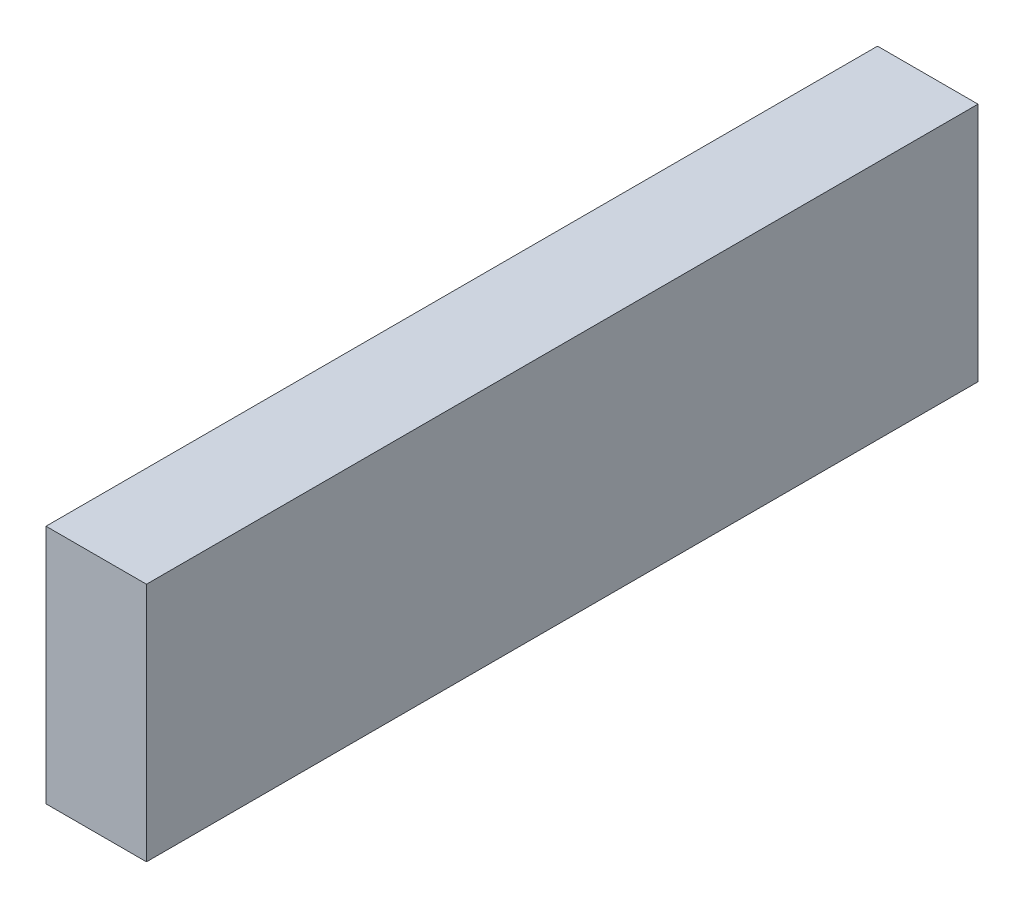
ISO-10303-21;
HEADER;
FILE_DESCRIPTION(('STEP AP214'),'2;1');
FILE_NAME('part.step','',(''),(''),'','','');
FILE_SCHEMA(('AUTOMOTIVE_DESIGN { 1 0 10303 214 1 1 1 1 }'));
ENDSEC;
DATA;
#1=APPLICATION_CONTEXT('core data for automotive mechanical design processes');
#2=APPLICATION_PROTOCOL_DEFINITION('international standard','automotive_design',2000,#1);
#3=PRODUCT_CONTEXT('',#1,'mechanical');
#4=PRODUCT('Part','Part','',(#3));
#5=PRODUCT_RELATED_PRODUCT_CATEGORY('part','',(#4));
#6=PRODUCT_DEFINITION_FORMATION('','',#4);
#7=PRODUCT_DEFINITION_CONTEXT('part definition',#1,'design');
#8=PRODUCT_DEFINITION('design','',#6,#7);
#9=PRODUCT_DEFINITION_SHAPE('','',#8);
#10=(LENGTH_UNIT() NAMED_UNIT(*) SI_UNIT(.MILLI.,.METRE.));
#11=(NAMED_UNIT(*) PLANE_ANGLE_UNIT() SI_UNIT($,.RADIAN.));
#12=(NAMED_UNIT(*) SI_UNIT($,.STERADIAN.) SOLID_ANGLE_UNIT());
#13=UNCERTAINTY_MEASURE_WITH_UNIT(LENGTH_MEASURE(1.E-05),#10,'distance_accuracy_value','');
#14=(GEOMETRIC_REPRESENTATION_CONTEXT(3) GLOBAL_UNCERTAINTY_ASSIGNED_CONTEXT((#13)) GLOBAL_UNIT_ASSIGNED_CONTEXT((#10,
#11,#12)) REPRESENTATION_CONTEXT('',''));
#15=CARTESIAN_POINT('',(0.,0.,0.));
#16=DIRECTION('',(0.,0.,1.));
#17=DIRECTION('',(1.,0.,0.));
#18=AXIS2_PLACEMENT_3D('',#15,#16,#17);
#19=CARTESIAN_POINT('',(0.,0.,76.2));
#20=DIRECTION('',(1.,0.,0.));
#21=DIRECTION('',(0.,0.,-1.));
#22=AXIS2_PLACEMENT_3D('',#19,#20,#21);
#23=PLANE('',#22);
#24=CARTESIAN_POINT('',(0.,23.876,49.6062));
#25=DIRECTION('',(1.,0.,0.));
#26=DIRECTION('',(0.,0.,-1.));
#27=AXIS2_PLACEMENT_3D('',#24,#25,#26);
#28=CIRCLE('',#27,9.9187);
#29=CARTESIAN_POINT('',(0.,23.876,39.6875));
#30=VERTEX_POINT('',#29);
#31=EDGE_CURVE('E252',#30,#30,#28,.T.);
#32=ORIENTED_EDGE('',*,*,#31,.T.);
#33=EDGE_LOOP('',(#32));
#34=FACE_BOUND('',#33,.T.);
#35=CARTESIAN_POINT('',(0.,23.876,-49.6062));
#36=DIRECTION('',(1.,0.,0.));
#37=DIRECTION('',(0.,0.,-1.));
#38=AXIS2_PLACEMENT_3D('',#35,#36,#37);
#39=CIRCLE('',#38,9.9187);
#40=CARTESIAN_POINT('',(0.,23.876,-59.5249));
#41=VERTEX_POINT('',#40);
#42=EDGE_CURVE('E195',#41,#41,#39,.T.);
#43=ORIENTED_EDGE('',*,*,#42,.T.);
#44=EDGE_LOOP('',(#43));
#45=FACE_BOUND('',#44,.T.);
#46=DIRECTION('',(0.,-1.,0.));
#47=VECTOR('',#46,1.);
#48=CARTESIAN_POINT('',(0.,0.,-76.2));
#49=LINE('',#48,#47);
#50=CARTESIAN_POINT('',(0.,44.069,-76.2));
#51=VERTEX_POINT('',#50);
#52=CARTESIAN_POINT('',(0.,0.,-76.2));
#53=VERTEX_POINT('',#52);
#54=EDGE_CURVE('E251',#51,#53,#49,.T.);
#55=ORIENTED_EDGE('',*,*,#54,.T.);
#56=DIRECTION('',(0.,0.,-1.));
#57=VECTOR('',#56,1.);
#58=CARTESIAN_POINT('',(0.,0.,76.2));
#59=LINE('',#58,#57);
#60=CARTESIAN_POINT('',(0.,0.,76.2));
#61=VERTEX_POINT('',#60);
#62=EDGE_CURVE('E286',#61,#53,#59,.T.);
#63=ORIENTED_EDGE('',*,*,#62,.F.);
#64=DIRECTION('',(0.,-1.,0.));
#65=VECTOR('',#64,1.);
#66=CARTESIAN_POINT('',(0.,0.,76.2));
#67=LINE('',#66,#65);
#68=CARTESIAN_POINT('',(0.,44.069,76.2));
#69=VERTEX_POINT('',#68);
#70=EDGE_CURVE('E260',#69,#61,#67,.T.);
#71=ORIENTED_EDGE('',*,*,#70,.F.);
#72=DIRECTION('',(0.,0.,-1.));
#73=VECTOR('',#72,1.);
#74=CARTESIAN_POINT('',(0.,44.069,76.2));
#75=LINE('',#74,#73);
#76=EDGE_CURVE('E270',#69,#51,#75,.T.);
#77=ORIENTED_EDGE('',*,*,#76,.T.);
#78=EDGE_LOOP('',(#55,#63,#71,#77));
#79=FACE_BOUND('',#78,.T.);
#80=ADVANCED_FACE('F34',(#34,#45,#79),#23,.F.);
#81=CARTESIAN_POINT('',(0.,0.,76.2));
#82=DIRECTION('',(0.,1.,0.));
#83=DIRECTION('',(0.,0.,1.));
#84=AXIS2_PLACEMENT_3D('',#81,#82,#83);
#85=PLANE('',#84);
#86=DIRECTION('',(1.,0.,0.));
#87=VECTOR('',#86,1.);
#88=CARTESIAN_POINT('',(0.,0.,-76.2));
#89=LINE('',#88,#87);
#90=CARTESIAN_POINT('',(18.415,0.,-76.2));
#91=VERTEX_POINT('',#90);
#92=EDGE_CURVE('E273',#53,#91,#89,.T.);
#93=ORIENTED_EDGE('',*,*,#92,.T.);
#94=DIRECTION('',(0.,0.,-1.));
#95=VECTOR('',#94,1.);
#96=CARTESIAN_POINT('',(18.415,0.,76.2));
#97=LINE('',#96,#95);
#98=CARTESIAN_POINT('',(18.415,0.,76.2));
#99=VERTEX_POINT('',#98);
#100=EDGE_CURVE('E283',#99,#91,#97,.T.);
#101=ORIENTED_EDGE('',*,*,#100,.F.);
#102=DIRECTION('',(1.,0.,0.));
#103=VECTOR('',#102,1.);
#104=CARTESIAN_POINT('',(0.,0.,76.2));
#105=LINE('',#104,#103);
#106=EDGE_CURVE('E263',#61,#99,#105,.T.);
#107=ORIENTED_EDGE('',*,*,#106,.F.);
#108=ORIENTED_EDGE('',*,*,#62,.T.);
#109=EDGE_LOOP('',(#93,#101,#107,#108));
#110=FACE_BOUND('',#109,.T.);
#111=ADVANCED_FACE('F315',(#110),#85,.F.);
#112=CARTESIAN_POINT('',(18.415,0.,76.2));
#113=DIRECTION('',(-1.,0.,0.));
#114=DIRECTION('',(0.,0.,1.));
#115=AXIS2_PLACEMENT_3D('',#112,#113,#114);
#116=PLANE('',#115);
#117=DIRECTION('',(0.,1.,0.));
#118=VECTOR('',#117,1.);
#119=CARTESIAN_POINT('',(18.415,0.,-76.2));
#120=LINE('',#119,#118);
#121=CARTESIAN_POINT('',(18.415,44.069,-76.2));
#122=VERTEX_POINT('',#121);
#123=EDGE_CURVE('E275',#91,#122,#120,.T.);
#124=ORIENTED_EDGE('',*,*,#123,.T.);
#125=DIRECTION('',(0.,0.,-1.));
#126=VECTOR('',#125,1.);
#127=CARTESIAN_POINT('',(18.415,44.069,76.2));
#128=LINE('',#127,#126);
#129=CARTESIAN_POINT('',(18.415,44.069,76.2));
#130=VERTEX_POINT('',#129);
#131=EDGE_CURVE('E280',#130,#122,#128,.T.);
#132=ORIENTED_EDGE('',*,*,#131,.F.);
#133=DIRECTION('',(0.,1.,0.));
#134=VECTOR('',#133,1.);
#135=CARTESIAN_POINT('',(18.415,0.,76.2));
#136=LINE('',#135,#134);
#137=EDGE_CURVE('E266',#99,#130,#136,.T.);
#138=ORIENTED_EDGE('',*,*,#137,.F.);
#139=ORIENTED_EDGE('',*,*,#100,.T.);
#140=EDGE_LOOP('',(#124,#132,#138,#139));
#141=FACE_BOUND('',#140,.T.);
#142=ADVANCED_FACE('F321',(#141),#116,.F.);
#143=CARTESIAN_POINT('',(0.,44.069,76.2));
#144=DIRECTION('',(0.,-1.,0.));
#145=DIRECTION('',(0.,0.,-1.));
#146=AXIS2_PLACEMENT_3D('',#143,#144,#145);
#147=PLANE('',#146);
#148=DIRECTION('',(-1.,0.,0.));
#149=VECTOR('',#148,1.);
#150=CARTESIAN_POINT('',(0.,44.069,-76.2));
#151=LINE('',#150,#149);
#152=EDGE_CURVE('E264',#122,#51,#151,.T.);
#153=ORIENTED_EDGE('',*,*,#152,.T.);
#154=ORIENTED_EDGE('',*,*,#76,.F.);
#155=DIRECTION('',(-1.,0.,0.));
#156=VECTOR('',#155,1.);
#157=CARTESIAN_POINT('',(0.,44.069,76.2));
#158=LINE('',#157,#156);
#159=EDGE_CURVE('E268',#130,#69,#158,.T.);
#160=ORIENTED_EDGE('',*,*,#159,.F.);
#161=ORIENTED_EDGE('',*,*,#131,.T.);
#162=EDGE_LOOP('',(#153,#154,#160,#161));
#163=FACE_BOUND('',#162,.T.);
#164=ADVANCED_FACE('F328',(#163),#147,.F.);
#165=CARTESIAN_POINT('',(0.,0.,76.2));
#166=DIRECTION('',(0.,0.,-1.));
#167=DIRECTION('',(-1.,0.,0.));
#168=AXIS2_PLACEMENT_3D('',#165,#166,#167);
#169=PLANE('',#168);
#170=ORIENTED_EDGE('',*,*,#70,.T.);
#171=ORIENTED_EDGE('',*,*,#106,.T.);
#172=ORIENTED_EDGE('',*,*,#137,.T.);
#173=ORIENTED_EDGE('',*,*,#159,.T.);
#174=EDGE_LOOP('',(#170,#171,#172,#173));
#175=FACE_BOUND('',#174,.T.);
#176=ADVANCED_FACE('F332',(#175),#169,.F.);
#177=CARTESIAN_POINT('',(0.,0.,-76.2));
#178=DIRECTION('',(0.,0.,-1.));
#179=DIRECTION('',(-1.,0.,0.));
#180=AXIS2_PLACEMENT_3D('',#177,#178,#179);
#181=PLANE('',#180);
#182=ORIENTED_EDGE('',*,*,#54,.F.);
#183=ORIENTED_EDGE('',*,*,#152,.F.);
#184=ORIENTED_EDGE('',*,*,#123,.F.);
#185=ORIENTED_EDGE('',*,*,#92,.F.);
#186=EDGE_LOOP('',(#182,#183,#184,#185));
#187=FACE_BOUND('',#186,.T.);
#188=ADVANCED_FACE('F334',(#187),#181,.T.);
#189=CARTESIAN_POINT('',(12.7,23.876,-49.6062));
#190=DIRECTION('',(-1.,0.,0.));
#191=DIRECTION('',(0.,0.,1.));
#192=AXIS2_PLACEMENT_3D('',#189,#190,#191);
#193=CYLINDRICAL_SURFACE('',#192,9.9187);
#194=CARTESIAN_POINT('',(12.7,23.876,-49.6062));
#195=DIRECTION('',(1.,0.,0.));
#196=DIRECTION('',(0.,0.,-1.));
#197=AXIS2_PLACEMENT_3D('',#194,#195,#196);
#198=CIRCLE('',#197,9.9187);
#199=CARTESIAN_POINT('',(12.7,23.876,-59.5249));
#200=VERTEX_POINT('',#199);
#201=EDGE_CURVE('E255',#200,#200,#198,.T.);
#202=ORIENTED_EDGE('',*,*,#201,.T.);
#203=EDGE_LOOP('',(#202));
#204=FACE_BOUND('',#203,.T.);
#205=ORIENTED_EDGE('',*,*,#42,.F.);
#206=EDGE_LOOP('',(#205));
#207=FACE_BOUND('',#206,.T.);
#208=ADVANCED_FACE('F337',(#204,#207),#193,.F.);
#209=CARTESIAN_POINT('',(12.7,23.876,-49.6062));
#210=DIRECTION('',(1.,0.,0.));
#211=DIRECTION('',(0.,0.,-1.));
#212=AXIS2_PLACEMENT_3D('',#209,#210,#211);
#213=PLANE('',#212);
#214=CARTESIAN_POINT('',(12.7,23.876,-49.6062));
#215=DIRECTION('',(1.,0.,0.));
#216=DIRECTION('',(0.,0.,-1.));
#217=AXIS2_PLACEMENT_3D('',#214,#215,#216);
#218=CIRCLE('',#217,9.525);
#219=CARTESIAN_POINT('',(12.7,23.876,-59.1312));
#220=VERTEX_POINT('',#219);
#221=EDGE_CURVE('E292',#220,#220,#218,.F.);
#222=ORIENTED_EDGE('',*,*,#221,.F.);
#223=EDGE_LOOP('',(#222));
#224=FACE_BOUND('',#223,.T.);
#225=ORIENTED_EDGE('',*,*,#201,.F.);
#226=EDGE_LOOP('',(#225));
#227=FACE_BOUND('',#226,.T.);
#228=ADVANCED_FACE('F344',(#224,#227),#213,.F.);
#229=CARTESIAN_POINT('',(12.7,23.876,49.6062));
#230=DIRECTION('',(-1.,0.,0.));
#231=DIRECTION('',(0.,0.,1.));
#232=AXIS2_PLACEMENT_3D('',#229,#230,#231);
#233=CYLINDRICAL_SURFACE('',#232,9.9187);
#234=CARTESIAN_POINT('',(12.7,23.876,49.6062));
#235=DIRECTION('',(1.,0.,0.));
#236=DIRECTION('',(0.,0.,-1.));
#237=AXIS2_PLACEMENT_3D('',#234,#235,#236);
#238=CIRCLE('',#237,9.9187);
#239=CARTESIAN_POINT('',(12.7,23.876,39.6875));
#240=VERTEX_POINT('',#239);
#241=EDGE_CURVE('E248',#240,#240,#238,.T.);
#242=ORIENTED_EDGE('',*,*,#241,.T.);
#243=EDGE_LOOP('',(#242));
#244=FACE_BOUND('',#243,.T.);
#245=ORIENTED_EDGE('',*,*,#31,.F.);
#246=EDGE_LOOP('',(#245));
#247=FACE_BOUND('',#246,.T.);
#248=ADVANCED_FACE('F348',(#244,#247),#233,.F.);
#249=CARTESIAN_POINT('',(12.7,23.876,49.6062));
#250=DIRECTION('',(1.,0.,0.));
#251=DIRECTION('',(0.,0.,-1.));
#252=AXIS2_PLACEMENT_3D('',#249,#250,#251);
#253=PLANE('',#252);
#254=CARTESIAN_POINT('',(12.7,23.876,49.6062));
#255=DIRECTION('',(1.,0.,0.));
#256=DIRECTION('',(0.,0.,-1.));
#257=AXIS2_PLACEMENT_3D('',#254,#255,#256);
#258=CIRCLE('',#257,9.525);
#259=CARTESIAN_POINT('',(12.7,23.876,40.0812));
#260=VERTEX_POINT('',#259);
#261=EDGE_CURVE('E289',#260,#260,#258,.F.);
#262=ORIENTED_EDGE('',*,*,#261,.F.);
#263=EDGE_LOOP('',(#262));
#264=FACE_BOUND('',#263,.T.);
#265=ORIENTED_EDGE('',*,*,#241,.F.);
#266=EDGE_LOOP('',(#265));
#267=FACE_BOUND('',#266,.T.);
#268=ADVANCED_FACE('F352',(#264,#267),#253,.F.);
#269=CARTESIAN_POINT('',(-26.9407683632075,23.876,49.6062));
#270=DIRECTION('',(1.,0.,0.));
#271=DIRECTION('',(0.,0.,-1.));
#272=AXIS2_PLACEMENT_3D('',#269,#270,#271);
#273=CYLINDRICAL_SURFACE('',#272,9.525);
#274=CARTESIAN_POINT('',(0.635000000000042,23.876,49.6062));
#275=DIRECTION('',(1.,0.,0.));
#276=DIRECTION('',(0.,0.,-1.));
#277=AXIS2_PLACEMENT_3D('',#274,#275,#276);
#278=CIRCLE('',#277,9.525);
#279=CARTESIAN_POINT('',(0.635000000000038,23.876,40.0812));
#280=VERTEX_POINT('',#279);
#281=EDGE_CURVE('E42',#280,#280,#278,.T.);
#282=CARTESIAN_POINT('',(0.635000000000038,23.876,40.0812));
#283=CARTESIAN_POINT('',(0.760677083333372,23.876,40.0812));
#284=CARTESIAN_POINT('',(0.886354166666705,23.876,40.0812));
#285=CARTESIAN_POINT('',(1.13770833333337,23.876,40.0812));
#286=CARTESIAN_POINT('',(1.2633854166667,23.876,40.0812));
#287=CARTESIAN_POINT('',(1.51473958333337,23.876,40.0812));
#288=CARTESIAN_POINT('',(1.6404166666667,23.876,40.0812));
#289=CARTESIAN_POINT('',(1.89177083333337,23.876,40.0812));
#290=CARTESIAN_POINT('',(2.0174479166667,23.876,40.0812));
#291=CARTESIAN_POINT('',(2.26880208333337,23.876,40.0812));
#292=CARTESIAN_POINT('',(2.3944791666667,23.876,40.0812));
#293=CARTESIAN_POINT('',(2.64583333333337,23.876,40.0812));
#294=CARTESIAN_POINT('',(2.7715104166667,23.876,40.0812));
#295=CARTESIAN_POINT('',(3.02286458333336,23.876,40.0812));
#296=CARTESIAN_POINT('',(3.1485416666667,23.876,40.0812));
#297=CARTESIAN_POINT('',(3.39989583333336,23.876,40.0812));
#298=CARTESIAN_POINT('',(3.5255729166667,23.876,40.0812));
#299=CARTESIAN_POINT('',(3.77692708333336,23.876,40.0812));
#300=CARTESIAN_POINT('',(3.9026041666667,23.876,40.0812));
#301=CARTESIAN_POINT('',(4.15395833333336,23.876,40.0812));
#302=CARTESIAN_POINT('',(4.27963541666669,23.876,40.0812));
#303=CARTESIAN_POINT('',(4.53098958333336,23.876,40.0812));
#304=CARTESIAN_POINT('',(4.65666666666669,23.876,40.0812));
#305=CARTESIAN_POINT('',(4.90802083333336,23.876,40.0812));
#306=CARTESIAN_POINT('',(5.03369791666669,23.876,40.0812));
#307=CARTESIAN_POINT('',(5.28505208333335,23.876,40.0812));
#308=CARTESIAN_POINT('',(5.41072916666668,23.876,40.0812));
#309=CARTESIAN_POINT('',(5.66208333333335,23.876,40.0812));
#310=CARTESIAN_POINT('',(5.78776041666668,23.876,40.0812));
#311=CARTESIAN_POINT('',(6.03911458333335,23.876,40.0812));
#312=CARTESIAN_POINT('',(6.16479166666668,23.876,40.0812));
#313=CARTESIAN_POINT('',(6.41614583333335,23.876,40.0812));
#314=CARTESIAN_POINT('',(6.54182291666668,23.876,40.0812));
#315=CARTESIAN_POINT('',(6.79317708333335,23.876,40.0812));
#316=CARTESIAN_POINT('',(6.91885416666668,23.876,40.0812));
#317=CARTESIAN_POINT('',(7.17020833333335,23.876,40.0812));
#318=CARTESIAN_POINT('',(7.29588541666668,23.876,40.0812));
#319=CARTESIAN_POINT('',(7.54723958333335,23.876,40.0812));
#320=CARTESIAN_POINT('',(7.67291666666668,23.876,40.0812));
#321=CARTESIAN_POINT('',(7.92427083333335,23.876,40.0812));
#322=CARTESIAN_POINT('',(8.04994791666668,23.876,40.0812));
#323=CARTESIAN_POINT('',(8.30130208333335,23.876,40.0812));
#324=CARTESIAN_POINT('',(8.42697916666668,23.876,40.0812));
#325=CARTESIAN_POINT('',(8.67833333333334,23.876,40.0812));
#326=CARTESIAN_POINT('',(8.80401041666668,23.876,40.0812));
#327=CARTESIAN_POINT('',(9.05536458333334,23.876,40.0812));
#328=CARTESIAN_POINT('',(9.18104166666668,23.876,40.0812));
#329=CARTESIAN_POINT('',(9.43239583333334,23.876,40.0812));
#330=CARTESIAN_POINT('',(9.55807291666668,23.876,40.0812));
#331=CARTESIAN_POINT('',(9.80942708333334,23.876,40.0812));
#332=CARTESIAN_POINT('',(9.93510416666668,23.876,40.0812));
#333=CARTESIAN_POINT('',(10.1864583333333,23.876,40.0812));
#334=CARTESIAN_POINT('',(10.3121354166667,23.876,40.0812));
#335=CARTESIAN_POINT('',(10.5634895833333,23.876,40.0812));
#336=CARTESIAN_POINT('',(10.6891666666667,23.876,40.0812));
#337=CARTESIAN_POINT('',(10.9405208333333,23.876,40.0812));
#338=CARTESIAN_POINT('',(11.0661979166667,23.876,40.0812));
#339=CARTESIAN_POINT('',(11.3175520833333,23.876,40.0812));
#340=CARTESIAN_POINT('',(11.4432291666667,23.876,40.0812));
#341=CARTESIAN_POINT('',(11.6945833333333,23.876,40.0812));
#342=CARTESIAN_POINT('',(11.8202604166667,23.876,40.0812));
#343=CARTESIAN_POINT('',(12.0716145833333,23.876,40.0812));
#344=CARTESIAN_POINT('',(12.1972916666667,23.876,40.0812));
#345=CARTESIAN_POINT('',(12.4486458333333,23.876,40.0812));
#346=CARTESIAN_POINT('',(12.5743229166667,23.876,40.0812));
#347=CARTESIAN_POINT('',(12.7,23.876,40.0812));
#348=B_SPLINE_CURVE_WITH_KNOTS('',3,(#282,#283,#284,#285,#286,#287,#288,#289,#290,#291,#292,
#293,#294,#295,#296,#297,#298,#299,#300,#301,#302,#303,#304,#305,#306,#307,#308,#309,#310,#311,
#312,#313,#314,#315,#316,#317,#318,#319,#320,#321,#322,#323,#324,#325,#326,#327,#328,#329,#330,
#331,#332,#333,#334,#335,#336,#337,#338,#339,#340,#341,#342,#343,#344,#345,#346,#347),
.UNSPECIFIED.,.F.,.F.,(4,2,2,2,2,2,2,2,2,2,2,2,2,2,2,2,2,2,2,2,2,2,2,2,2,2,2,2,2,2,2,2,4),(0.,
0.37703125,0.7540625,1.13109375,1.508125,1.88515625,2.26218749999999,2.63921874999999,
3.01624999999999,3.39328124999999,3.77031249999999,4.14734374999999,4.52437499999998,
4.90140624999998,5.27843749999998,5.65546874999998,6.03249999999998,6.40953124999998,
6.78656249999998,7.16359374999998,7.54062499999998,7.91765624999997,8.29468749999997,
8.67171874999997,9.04874999999997,9.42578124999997,9.80281249999997,10.17984375,10.556875,
10.93390625,11.3109375,11.68796875,12.065),.UNSPECIFIED.);
#349=EDGE_CURVE('BSEAM303',#280,#260,#348,.T.);
#350=ORIENTED_EDGE('',*,*,#281,.T.);
#351=ORIENTED_EDGE('',*,*,#261,.T.);
#352=ORIENTED_EDGE('',*,*,#349,.T.);
#353=ORIENTED_EDGE('',*,*,#349,.F.);
#354=EDGE_LOOP('',(#350,#352,#351,#353));
#355=FACE_BOUND('',#354,.T.);
#356=ADVANCED_FACE('F303',(#355),#273,.T.);
#357=CARTESIAN_POINT('',(0.,0.,76.2));
#358=DIRECTION('',(1.,0.,0.));
#359=DIRECTION('',(0.,0.,-1.));
#360=AXIS2_PLACEMENT_3D('',#357,#358,#359);
#361=PLANE('',#360);
#362=CARTESIAN_POINT('',(0.,23.876,49.6062));
#363=DIRECTION('',(1.,0.,0.));
#364=DIRECTION('',(0.,0.,-1.));
#365=AXIS2_PLACEMENT_3D('',#362,#363,#364);
#366=CIRCLE('',#365,8.88999999999995);
#367=CARTESIAN_POINT('',(0.,23.876,40.7162000000001));
#368=VERTEX_POINT('',#367);
#369=EDGE_CURVE('E11',#368,#368,#366,.F.);
#370=ORIENTED_EDGE('',*,*,#369,.T.);
#371=EDGE_LOOP('',(#370));
#372=FACE_BOUND('',#371,.T.);
#373=DIRECTION('',(0.,-0.900522194375788,0.43481004753411));
#374=VECTOR('',#373,1.);
#375=CARTESIAN_POINT('',(0.,24.4164274421299,42.2937946834762));
#376=LINE('',#375,#374);
#377=CARTESIAN_POINT('',(0.,24.4164274421299,42.2937946834762));
#378=VERTEX_POINT('',#377);
#379=CARTESIAN_POINT('',(0.,17.8134849541869,45.4819734479514));
#380=VERTEX_POINT('',#379);
#381=EDGE_CURVE('E182',#378,#380,#376,.T.);
#382=ORIENTED_EDGE('',*,*,#381,.F.);
#383=DIRECTION('',(0.,-0.826817644173152,-0.562470073234086));
#384=VECTOR('',#383,1.);
#385=CARTESIAN_POINT('',(0.,30.478942487943,46.4180212355249));
#386=LINE('',#385,#384);
#387=CARTESIAN_POINT('',(0.,30.478942487943,46.4180212355249));
#388=VERTEX_POINT('',#387);
#389=EDGE_CURVE('E49',#388,#378,#386,.T.);
#390=ORIENTED_EDGE('',*,*,#389,.F.);
#391=DIRECTION('',(0.,0.0737045502026413,-0.997280120768195));
#392=VECTOR('',#391,1.);
#393=CARTESIAN_POINT('',(0.,29.9385150458131,53.7304265520487));
#394=LINE('',#393,#392);
#395=CARTESIAN_POINT('',(0.,29.9385150458131,53.7304265520487));
#396=VERTEX_POINT('',#395);
#397=EDGE_CURVE('E168',#396,#388,#394,.T.);
#398=ORIENTED_EDGE('',*,*,#397,.F.);
#399=DIRECTION('',(0.,0.900522194375789,-0.434810047534108));
#400=VECTOR('',#399,1.);
#401=CARTESIAN_POINT('',(0.,23.3355725578701,56.9186053165239));
#402=LINE('',#401,#400);
#403=CARTESIAN_POINT('',(0.,23.3355725578701,56.9186053165239));
#404=VERTEX_POINT('',#403);
#405=EDGE_CURVE('E171',#404,#396,#402,.T.);
#406=ORIENTED_EDGE('',*,*,#405,.F.);
#407=DIRECTION('',(0.,0.826817644173149,0.562470073234091));
#408=VECTOR('',#407,1.);
#409=CARTESIAN_POINT('',(0.,17.273057512057,52.7943787644752));
#410=LINE('',#409,#408);
#411=CARTESIAN_POINT('',(0.,17.273057512057,52.7943787644752));
#412=VERTEX_POINT('',#411);
#413=EDGE_CURVE('E188',#412,#404,#410,.T.);
#414=ORIENTED_EDGE('',*,*,#413,.F.);
#415=DIRECTION('',(0.,-0.0737045502026381,0.997280120768196));
#416=VECTOR('',#415,1.);
#417=CARTESIAN_POINT('',(0.,17.8134849541869,45.4819734479514));
#418=LINE('',#417,#416);
#419=EDGE_CURVE('E185',#380,#412,#418,.T.);
#420=ORIENTED_EDGE('',*,*,#419,.F.);
#421=EDGE_LOOP('',(#382,#390,#398,#406,#414,#420));
#422=FACE_BOUND('',#421,.T.);
#423=ADVANCED_FACE('F359',(#372,#422),#361,.F.);
#424=CARTESIAN_POINT('',(-26.9407683632075,23.876,-49.6062));
#425=DIRECTION('',(1.,0.,0.));
#426=DIRECTION('',(0.,0.,-1.));
#427=AXIS2_PLACEMENT_3D('',#424,#425,#426);
#428=CYLINDRICAL_SURFACE('',#427,9.525);
#429=CARTESIAN_POINT('',(0.635000000000042,23.876,-49.6062));
#430=DIRECTION('',(1.,0.,0.));
#431=DIRECTION('',(0.,0.,-1.));
#432=AXIS2_PLACEMENT_3D('',#429,#430,#431);
#433=CIRCLE('',#432,9.525);
#434=CARTESIAN_POINT('',(0.635000000000038,23.876,-59.1312));
#435=VERTEX_POINT('',#434);
#436=EDGE_CURVE('E295',#435,#435,#433,.T.);
#437=CARTESIAN_POINT('',(0.635000000000038,23.876,-59.1312));
#438=CARTESIAN_POINT('',(0.760677083333372,23.876,-59.1312));
#439=CARTESIAN_POINT('',(0.886354166666705,23.876,-59.1312));
#440=CARTESIAN_POINT('',(1.13770833333337,23.876,-59.1312));
#441=CARTESIAN_POINT('',(1.2633854166667,23.876,-59.1312));
#442=CARTESIAN_POINT('',(1.51473958333337,23.876,-59.1312));
#443=CARTESIAN_POINT('',(1.6404166666667,23.876,-59.1312));
#444=CARTESIAN_POINT('',(1.89177083333337,23.876,-59.1312));
#445=CARTESIAN_POINT('',(2.0174479166667,23.876,-59.1312));
#446=CARTESIAN_POINT('',(2.26880208333337,23.876,-59.1312));
#447=CARTESIAN_POINT('',(2.3944791666667,23.876,-59.1312));
#448=CARTESIAN_POINT('',(2.64583333333337,23.876,-59.1312));
#449=CARTESIAN_POINT('',(2.7715104166667,23.876,-59.1312));
#450=CARTESIAN_POINT('',(3.02286458333336,23.876,-59.1312));
#451=CARTESIAN_POINT('',(3.1485416666667,23.876,-59.1312));
#452=CARTESIAN_POINT('',(3.39989583333336,23.876,-59.1312));
#453=CARTESIAN_POINT('',(3.5255729166667,23.876,-59.1312));
#454=CARTESIAN_POINT('',(3.77692708333336,23.876,-59.1312));
#455=CARTESIAN_POINT('',(3.9026041666667,23.876,-59.1312));
#456=CARTESIAN_POINT('',(4.15395833333336,23.876,-59.1312));
#457=CARTESIAN_POINT('',(4.27963541666669,23.876,-59.1312));
#458=CARTESIAN_POINT('',(4.53098958333336,23.876,-59.1312));
#459=CARTESIAN_POINT('',(4.65666666666669,23.876,-59.1312));
#460=CARTESIAN_POINT('',(4.90802083333336,23.876,-59.1312));
#461=CARTESIAN_POINT('',(5.03369791666669,23.876,-59.1312));
#462=CARTESIAN_POINT('',(5.28505208333335,23.876,-59.1312));
#463=CARTESIAN_POINT('',(5.41072916666668,23.876,-59.1312));
#464=CARTESIAN_POINT('',(5.66208333333335,23.876,-59.1312));
#465=CARTESIAN_POINT('',(5.78776041666668,23.876,-59.1312));
#466=CARTESIAN_POINT('',(6.03911458333335,23.876,-59.1312));
#467=CARTESIAN_POINT('',(6.16479166666668,23.876,-59.1312));
#468=CARTESIAN_POINT('',(6.41614583333335,23.876,-59.1312));
#469=CARTESIAN_POINT('',(6.54182291666668,23.876,-59.1312));
#470=CARTESIAN_POINT('',(6.79317708333335,23.876,-59.1312));
#471=CARTESIAN_POINT('',(6.91885416666668,23.876,-59.1312));
#472=CARTESIAN_POINT('',(7.17020833333335,23.876,-59.1312));
#473=CARTESIAN_POINT('',(7.29588541666668,23.876,-59.1312));
#474=CARTESIAN_POINT('',(7.54723958333335,23.876,-59.1312));
#475=CARTESIAN_POINT('',(7.67291666666668,23.876,-59.1312));
#476=CARTESIAN_POINT('',(7.92427083333335,23.876,-59.1312));
#477=CARTESIAN_POINT('',(8.04994791666668,23.876,-59.1312));
#478=CARTESIAN_POINT('',(8.30130208333335,23.876,-59.1312));
#479=CARTESIAN_POINT('',(8.42697916666668,23.876,-59.1312));
#480=CARTESIAN_POINT('',(8.67833333333334,23.876,-59.1312));
#481=CARTESIAN_POINT('',(8.80401041666668,23.876,-59.1312));
#482=CARTESIAN_POINT('',(9.05536458333334,23.876,-59.1312));
#483=CARTESIAN_POINT('',(9.18104166666668,23.876,-59.1312));
#484=CARTESIAN_POINT('',(9.43239583333334,23.876,-59.1312));
#485=CARTESIAN_POINT('',(9.55807291666668,23.876,-59.1312));
#486=CARTESIAN_POINT('',(9.80942708333334,23.876,-59.1312));
#487=CARTESIAN_POINT('',(9.93510416666668,23.876,-59.1312));
#488=CARTESIAN_POINT('',(10.1864583333333,23.876,-59.1312));
#489=CARTESIAN_POINT('',(10.3121354166667,23.876,-59.1312));
#490=CARTESIAN_POINT('',(10.5634895833333,23.876,-59.1312));
#491=CARTESIAN_POINT('',(10.6891666666667,23.876,-59.1312));
#492=CARTESIAN_POINT('',(10.9405208333333,23.876,-59.1312));
#493=CARTESIAN_POINT('',(11.0661979166667,23.876,-59.1312));
#494=CARTESIAN_POINT('',(11.3175520833333,23.876,-59.1312));
#495=CARTESIAN_POINT('',(11.4432291666667,23.876,-59.1312));
#496=CARTESIAN_POINT('',(11.6945833333333,23.876,-59.1312));
#497=CARTESIAN_POINT('',(11.8202604166667,23.876,-59.1312));
#498=CARTESIAN_POINT('',(12.0716145833333,23.876,-59.1312));
#499=CARTESIAN_POINT('',(12.1972916666667,23.876,-59.1312));
#500=CARTESIAN_POINT('',(12.4486458333333,23.876,-59.1312));
#501=CARTESIAN_POINT('',(12.5743229166667,23.876,-59.1312));
#502=CARTESIAN_POINT('',(12.7,23.876,-59.1312));
#503=B_SPLINE_CURVE_WITH_KNOTS('',3,(#437,#438,#439,#440,#441,#442,#443,#444,#445,#446,#447,
#448,#449,#450,#451,#452,#453,#454,#455,#456,#457,#458,#459,#460,#461,#462,#463,#464,#465,#466,
#467,#468,#469,#470,#471,#472,#473,#474,#475,#476,#477,#478,#479,#480,#481,#482,#483,#484,#485,
#486,#487,#488,#489,#490,#491,#492,#493,#494,#495,#496,#497,#498,#499,#500,#501,#502),
.UNSPECIFIED.,.F.,.F.,(4,2,2,2,2,2,2,2,2,2,2,2,2,2,2,2,2,2,2,2,2,2,2,2,2,2,2,2,2,2,2,2,4),(0.,
0.37703125,0.7540625,1.13109375,1.508125,1.88515625,2.26218749999999,2.63921874999999,
3.01624999999999,3.39328124999999,3.77031249999999,4.14734374999999,4.52437499999998,
4.90140624999998,5.27843749999998,5.65546874999998,6.03249999999998,6.40953124999998,
6.78656249999998,7.16359374999998,7.54062499999998,7.91765624999997,8.29468749999997,
8.67171874999997,9.04874999999997,9.42578124999997,9.80281249999997,10.17984375,10.556875,
10.93390625,11.3109375,11.68796875,12.065),.UNSPECIFIED.);
#504=EDGE_CURVE('BSEAM362',#435,#220,#503,.T.);
#505=ORIENTED_EDGE('',*,*,#436,.T.);
#506=ORIENTED_EDGE('',*,*,#221,.T.);
#507=ORIENTED_EDGE('',*,*,#504,.T.);
#508=ORIENTED_EDGE('',*,*,#504,.F.);
#509=EDGE_LOOP('',(#505,#507,#506,#508));
#510=FACE_BOUND('',#509,.T.);
#511=ADVANCED_FACE('F362',(#510),#428,.T.);
#512=CARTESIAN_POINT('',(0.,0.,76.2));
#513=DIRECTION('',(1.,0.,0.));
#514=DIRECTION('',(0.,0.,-1.));
#515=AXIS2_PLACEMENT_3D('',#512,#513,#514);
#516=PLANE('',#515);
#517=CARTESIAN_POINT('',(0.,23.876,-49.6062));
#518=DIRECTION('',(1.,0.,0.));
#519=DIRECTION('',(0.,0.,-1.));
#520=AXIS2_PLACEMENT_3D('',#517,#518,#519);
#521=CIRCLE('',#520,8.88999999999995);
#522=CARTESIAN_POINT('',(0.,23.876,-58.4962));
#523=VERTEX_POINT('',#522);
#524=EDGE_CURVE('E298',#523,#523,#521,.F.);
#525=ORIENTED_EDGE('',*,*,#524,.T.);
#526=EDGE_LOOP('',(#525));
#527=FACE_BOUND('',#526,.T.);
#528=DIRECTION('',(0.,0.826817644173156,-0.562470073234081));
#529=VECTOR('',#528,1.);
#530=CARTESIAN_POINT('',(0.,24.4164274421299,-42.2937946834762));
#531=LINE('',#530,#529);
#532=CARTESIAN_POINT('',(0.,24.4164274421299,-42.2937946834761));
#533=VERTEX_POINT('',#532);
#534=CARTESIAN_POINT('',(0.,30.478942487943,-46.4180212355248));
#535=VERTEX_POINT('',#534);
#536=EDGE_CURVE('E224',#533,#535,#531,.T.);
#537=ORIENTED_EDGE('',*,*,#536,.F.);
#538=DIRECTION('',(0.,0.900522194375787,0.434810047534113));
#539=VECTOR('',#538,1.);
#540=CARTESIAN_POINT('',(0.,17.8134849541869,-45.4819734479514));
#541=LINE('',#540,#539);
#542=CARTESIAN_POINT('',(0.,17.8134849541869,-45.4819734479514));
#543=VERTEX_POINT('',#542);
#544=EDGE_CURVE('E57',#543,#533,#541,.T.);
#545=ORIENTED_EDGE('',*,*,#544,.F.);
#546=DIRECTION('',(0.,0.0737045502026295,0.997280120768196));
#547=VECTOR('',#546,1.);
#548=CARTESIAN_POINT('',(0.,17.273057512057,-52.7943787644752));
#549=LINE('',#548,#547);
#550=CARTESIAN_POINT('',(0.,17.273057512057,-52.7943787644752));
#551=VERTEX_POINT('',#550);
#552=EDGE_CURVE('E207',#551,#543,#549,.T.);
#553=ORIENTED_EDGE('',*,*,#552,.F.);
#554=DIRECTION('',(0.,-0.826817644173156,0.562470073234081));
#555=VECTOR('',#554,1.);
#556=CARTESIAN_POINT('',(0.,23.3355725578702,-56.9186053165239));
#557=LINE('',#556,#555);
#558=CARTESIAN_POINT('',(0.,23.3355725578702,-56.9186053165239));
#559=VERTEX_POINT('',#558);
#560=EDGE_CURVE('E233',#559,#551,#557,.T.);
#561=ORIENTED_EDGE('',*,*,#560,.F.);
#562=DIRECTION('',(0.,-0.900522194375786,-0.434810047534115));
#563=VECTOR('',#562,1.);
#564=CARTESIAN_POINT('',(0.,29.9385150458131,-53.7304265520486));
#565=LINE('',#564,#563);
#566=CARTESIAN_POINT('',(0.,29.9385150458131,-53.7304265520486));
#567=VERTEX_POINT('',#566);
#568=EDGE_CURVE('E230',#567,#559,#565,.T.);
#569=ORIENTED_EDGE('',*,*,#568,.F.);
#570=DIRECTION('',(0.,-0.073704550202629,-0.997280120768196));
#571=VECTOR('',#570,1.);
#572=CARTESIAN_POINT('',(0.,30.478942487943,-46.4180212355248));
#573=LINE('',#572,#571);
#574=EDGE_CURVE('E227',#535,#567,#573,.T.);
#575=ORIENTED_EDGE('',*,*,#574,.F.);
#576=EDGE_LOOP('',(#537,#545,#553,#561,#569,#575));
#577=FACE_BOUND('',#576,.T.);
#578=ADVANCED_FACE('F366',(#527,#577),#516,.F.);
#579=CARTESIAN_POINT('',(6.35,17.8134849541869,-45.4819734479514));
#580=DIRECTION('',(0.,-0.434810047534114,0.900522194375787));
#581=DIRECTION('',(0.,-0.900522194375787,-0.434810047534114));
#582=AXIS2_PLACEMENT_3D('',#579,#580,#581);
#583=PLANE('',#582);
#584=ORIENTED_EDGE('',*,*,#544,.T.);
#585=DIRECTION('',(-1.,0.,0.));
#586=VECTOR('',#585,1.);
#587=CARTESIAN_POINT('',(6.35,24.4164274421299,-42.2937946834762));
#588=LINE('',#587,#586);
#589=CARTESIAN_POINT('',(6.35,24.4164274421299,-42.2937946834762));
#590=VERTEX_POINT('',#589);
#591=EDGE_CURVE('E222',#590,#533,#588,.T.);
#592=ORIENTED_EDGE('',*,*,#591,.F.);
#593=DIRECTION('',(0.,0.900522194375787,0.434810047534113));
#594=VECTOR('',#593,1.);
#595=CARTESIAN_POINT('',(6.35,17.8134849541869,-45.4819734479514));
#596=LINE('',#595,#594);
#597=CARTESIAN_POINT('',(6.35,17.8134849541869,-45.4819734479514));
#598=VERTEX_POINT('',#597);
#599=EDGE_CURVE('E203',#598,#590,#596,.T.);
#600=ORIENTED_EDGE('',*,*,#599,.F.);
#601=DIRECTION('',(-1.,0.,0.));
#602=VECTOR('',#601,1.);
#603=CARTESIAN_POINT('',(6.35,17.8134849541869,-45.4819734479514));
#604=LINE('',#603,#602);
#605=EDGE_CURVE('E183',#598,#543,#604,.T.);
#606=ORIENTED_EDGE('',*,*,#605,.T.);
#607=EDGE_LOOP('',(#584,#592,#600,#606));
#608=FACE_BOUND('',#607,.T.);
#609=ADVANCED_FACE('F370',(#608),#583,.F.);
#610=CARTESIAN_POINT('',(6.35,17.273057512057,-52.7943787644752));
#611=DIRECTION('',(0.,-0.997280120768196,0.0737045502026295));
#612=DIRECTION('',(0.,-0.0737045502026295,-0.997280120768196));
#613=AXIS2_PLACEMENT_3D('',#610,#611,#612);
#614=PLANE('',#613);
#615=ORIENTED_EDGE('',*,*,#552,.T.);
#616=ORIENTED_EDGE('',*,*,#605,.F.);
#617=DIRECTION('',(0.,0.0737045502026295,0.997280120768196));
#618=VECTOR('',#617,1.);
#619=CARTESIAN_POINT('',(6.35,17.273057512057,-52.7943787644752));
#620=LINE('',#619,#618);
#621=CARTESIAN_POINT('',(6.35,17.273057512057,-52.7943787644752));
#622=VERTEX_POINT('',#621);
#623=EDGE_CURVE('E219',#622,#598,#620,.T.);
#624=ORIENTED_EDGE('',*,*,#623,.F.);
#625=DIRECTION('',(-1.,0.,0.));
#626=VECTOR('',#625,1.);
#627=CARTESIAN_POINT('',(6.35,17.273057512057,-52.7943787644752));
#628=LINE('',#627,#626);
#629=EDGE_CURVE('E239',#622,#551,#628,.T.);
#630=ORIENTED_EDGE('',*,*,#629,.T.);
#631=EDGE_LOOP('',(#615,#616,#624,#630));
#632=FACE_BOUND('',#631,.T.);
#633=ADVANCED_FACE('F374',(#632),#614,.F.);
#634=CARTESIAN_POINT('',(6.35,23.3355725578702,-56.9186053165239));
#635=DIRECTION('',(0.,-0.562470073234081,-0.826817644173156));
#636=DIRECTION('',(0.,0.826817644173156,-0.562470073234081));
#637=AXIS2_PLACEMENT_3D('',#634,#635,#636);
#638=PLANE('',#637);
#639=ORIENTED_EDGE('',*,*,#560,.T.);
#640=ORIENTED_EDGE('',*,*,#629,.F.);
#641=DIRECTION('',(0.,-0.826817644173156,0.562470073234081));
#642=VECTOR('',#641,1.);
#643=CARTESIAN_POINT('',(6.35,23.3355725578702,-56.9186053165239));
#644=LINE('',#643,#642);
#645=CARTESIAN_POINT('',(6.35,23.3355725578702,-56.9186053165239));
#646=VERTEX_POINT('',#645);
#647=EDGE_CURVE('E216',#646,#622,#644,.T.);
#648=ORIENTED_EDGE('',*,*,#647,.F.);
#649=DIRECTION('',(-1.,0.,0.));
#650=VECTOR('',#649,1.);
#651=CARTESIAN_POINT('',(6.35,23.3355725578702,-56.9186053165239));
#652=LINE('',#651,#650);
#653=EDGE_CURVE('E241',#646,#559,#652,.T.);
#654=ORIENTED_EDGE('',*,*,#653,.T.);
#655=EDGE_LOOP('',(#639,#640,#648,#654));
#656=FACE_BOUND('',#655,.T.);
#657=ADVANCED_FACE('F387',(#656),#638,.F.);
#658=CARTESIAN_POINT('',(6.35,29.9385150458131,-53.7304265520486));
#659=DIRECTION('',(0.,0.434810047534115,-0.900522194375786));
#660=DIRECTION('',(0.,0.900522194375786,0.434810047534115));
#661=AXIS2_PLACEMENT_3D('',#658,#659,#660);
#662=PLANE('',#661);
#663=ORIENTED_EDGE('',*,*,#568,.T.);
#664=ORIENTED_EDGE('',*,*,#653,.F.);
#665=DIRECTION('',(0.,-0.900522194375786,-0.434810047534115));
#666=VECTOR('',#665,1.);
#667=CARTESIAN_POINT('',(6.35,29.9385150458131,-53.7304265520486));
#668=LINE('',#667,#666);
#669=CARTESIAN_POINT('',(6.35,29.9385150458131,-53.7304265520486));
#670=VERTEX_POINT('',#669);
#671=EDGE_CURVE('E213',#670,#646,#668,.T.);
#672=ORIENTED_EDGE('',*,*,#671,.F.);
#673=DIRECTION('',(-1.,0.,0.));
#674=VECTOR('',#673,1.);
#675=CARTESIAN_POINT('',(6.35,29.9385150458131,-53.7304265520486));
#676=LINE('',#675,#674);
#677=EDGE_CURVE('E243',#670,#567,#676,.T.);
#678=ORIENTED_EDGE('',*,*,#677,.T.);
#679=EDGE_LOOP('',(#663,#664,#672,#678));
#680=FACE_BOUND('',#679,.T.);
#681=ADVANCED_FACE('F383',(#680),#662,.F.);
#682=CARTESIAN_POINT('',(6.35,30.478942487943,-46.4180212355248));
#683=DIRECTION('',(0.,0.997280120768196,-0.073704550202629));
#684=DIRECTION('',(0.,0.073704550202629,0.997280120768196));
#685=AXIS2_PLACEMENT_3D('',#682,#683,#684);
#686=PLANE('',#685);
#687=ORIENTED_EDGE('',*,*,#574,.T.);
#688=ORIENTED_EDGE('',*,*,#677,.F.);
#689=DIRECTION('',(0.,-0.073704550202629,-0.997280120768196));
#690=VECTOR('',#689,1.);
#691=CARTESIAN_POINT('',(6.35,30.478942487943,-46.4180212355248));
#692=LINE('',#691,#690);
#693=CARTESIAN_POINT('',(6.35,30.478942487943,-46.4180212355248));
#694=VERTEX_POINT('',#693);
#695=EDGE_CURVE('E210',#694,#670,#692,.T.);
#696=ORIENTED_EDGE('',*,*,#695,.F.);
#697=DIRECTION('',(-1.,0.,0.));
#698=VECTOR('',#697,1.);
#699=CARTESIAN_POINT('',(6.35,30.478942487943,-46.4180212355248));
#700=LINE('',#699,#698);
#701=EDGE_CURVE('E245',#694,#535,#700,.T.);
#702=ORIENTED_EDGE('',*,*,#701,.T.);
#703=EDGE_LOOP('',(#687,#688,#696,#702));
#704=FACE_BOUND('',#703,.T.);
#705=ADVANCED_FACE('F379',(#704),#686,.F.);
#706=CARTESIAN_POINT('',(6.35,24.4164274421299,-42.2937946834762));
#707=DIRECTION('',(0.,0.562470073234081,0.826817644173156));
#708=DIRECTION('',(0.,-0.826817644173156,0.562470073234081));
#709=AXIS2_PLACEMENT_3D('',#706,#707,#708);
#710=PLANE('',#709);
#711=ORIENTED_EDGE('',*,*,#536,.T.);
#712=ORIENTED_EDGE('',*,*,#701,.F.);
#713=DIRECTION('',(0.,0.826817644173156,-0.562470073234081));
#714=VECTOR('',#713,1.);
#715=CARTESIAN_POINT('',(6.35,24.4164274421299,-42.2937946834762));
#716=LINE('',#715,#714);
#717=EDGE_CURVE('E206',#590,#694,#716,.T.);
#718=ORIENTED_EDGE('',*,*,#717,.F.);
#719=ORIENTED_EDGE('',*,*,#591,.T.);
#720=EDGE_LOOP('',(#711,#712,#718,#719));
#721=FACE_BOUND('',#720,.T.);
#722=ADVANCED_FACE('F375',(#721),#710,.F.);
#723=CARTESIAN_POINT('',(6.35,0.,0.));
#724=DIRECTION('',(-1.,0.,0.));
#725=DIRECTION('',(0.,0.,1.));
#726=AXIS2_PLACEMENT_3D('',#723,#724,#725);
#727=PLANE('',#726);
#728=ORIENTED_EDGE('',*,*,#599,.T.);
#729=ORIENTED_EDGE('',*,*,#717,.T.);
#730=ORIENTED_EDGE('',*,*,#695,.T.);
#731=ORIENTED_EDGE('',*,*,#671,.T.);
#732=ORIENTED_EDGE('',*,*,#647,.T.);
#733=ORIENTED_EDGE('',*,*,#623,.T.);
#734=EDGE_LOOP('',(#728,#729,#730,#731,#732,#733));
#735=FACE_BOUND('',#734,.T.);
#736=ADVANCED_FACE('F378',(#735),#727,.T.);
#737=CARTESIAN_POINT('',(6.35,30.478942487943,46.4180212355249));
#738=DIRECTION('',(0.,0.562470073234086,-0.826817644173153));
#739=DIRECTION('',(0.,0.826817644173153,0.562470073234086));
#740=AXIS2_PLACEMENT_3D('',#737,#738,#739);
#741=PLANE('',#740);
#742=ORIENTED_EDGE('',*,*,#389,.T.);
#743=DIRECTION('',(-1.,0.,0.));
#744=VECTOR('',#743,1.);
#745=CARTESIAN_POINT('',(6.35,24.4164274421299,42.2937946834762));
#746=LINE('',#745,#744);
#747=CARTESIAN_POINT('',(6.35,24.4164274421299,42.2937946834762));
#748=VERTEX_POINT('',#747);
#749=EDGE_CURVE('E145',#748,#378,#746,.T.);
#750=ORIENTED_EDGE('',*,*,#749,.F.);
#751=DIRECTION('',(0.,-0.826817644173152,-0.562470073234086));
#752=VECTOR('',#751,1.);
#753=CARTESIAN_POINT('',(6.35,30.478942487943,46.4180212355249));
#754=LINE('',#753,#752);
#755=CARTESIAN_POINT('',(6.35,30.478942487943,46.4180212355249));
#756=VERTEX_POINT('',#755);
#757=EDGE_CURVE('E149',#756,#748,#754,.T.);
#758=ORIENTED_EDGE('',*,*,#757,.F.);
#759=DIRECTION('',(-1.,0.,0.));
#760=VECTOR('',#759,1.);
#761=CARTESIAN_POINT('',(6.35,30.478942487943,46.4180212355249));
#762=LINE('',#761,#760);
#763=EDGE_CURVE('E193',#756,#388,#762,.T.);
#764=ORIENTED_EDGE('',*,*,#763,.T.);
#765=EDGE_LOOP('',(#742,#750,#758,#764));
#766=FACE_BOUND('',#765,.T.);
#767=ADVANCED_FACE('F147',(#766),#741,.F.);
#768=CARTESIAN_POINT('',(6.35,29.9385150458131,53.7304265520487));
#769=DIRECTION('',(0.,0.997280120768195,0.0737045502026413));
#770=DIRECTION('',(0.,-0.0737045502026413,0.997280120768195));
#771=AXIS2_PLACEMENT_3D('',#768,#769,#770);
#772=PLANE('',#771);
#773=ORIENTED_EDGE('',*,*,#397,.T.);
#774=ORIENTED_EDGE('',*,*,#763,.F.);
#775=DIRECTION('',(0.,0.0737045502026413,-0.997280120768195));
#776=VECTOR('',#775,1.);
#777=CARTESIAN_POINT('',(6.35,29.9385150458131,53.7304265520487));
#778=LINE('',#777,#776);
#779=CARTESIAN_POINT('',(6.35,29.9385150458131,53.7304265520487));
#780=VERTEX_POINT('',#779);
#781=EDGE_CURVE('E155',#780,#756,#778,.T.);
#782=ORIENTED_EDGE('',*,*,#781,.F.);
#783=DIRECTION('',(-1.,0.,0.));
#784=VECTOR('',#783,1.);
#785=CARTESIAN_POINT('',(6.35,29.9385150458131,53.7304265520487));
#786=LINE('',#785,#784);
#787=EDGE_CURVE('E196',#780,#396,#786,.T.);
#788=ORIENTED_EDGE('',*,*,#787,.T.);
#789=EDGE_LOOP('',(#773,#774,#782,#788));
#790=FACE_BOUND('',#789,.T.);
#791=ADVANCED_FACE('F400',(#790),#772,.F.);
#792=CARTESIAN_POINT('',(6.35,23.3355725578701,56.9186053165239));
#793=DIRECTION('',(0.,0.434810047534108,0.900522194375789));
#794=DIRECTION('',(0.,-0.90052219437579,0.434810047534108));
#795=AXIS2_PLACEMENT_3D('',#792,#793,#794);
#796=PLANE('',#795);
#797=ORIENTED_EDGE('',*,*,#405,.T.);
#798=ORIENTED_EDGE('',*,*,#787,.F.);
#799=DIRECTION('',(0.,0.900522194375789,-0.434810047534108));
#800=VECTOR('',#799,1.);
#801=CARTESIAN_POINT('',(6.35,23.3355725578701,56.9186053165239));
#802=LINE('',#801,#800);
#803=CARTESIAN_POINT('',(6.35,23.3355725578701,56.9186053165239));
#804=VERTEX_POINT('',#803);
#805=EDGE_CURVE('E178',#804,#780,#802,.T.);
#806=ORIENTED_EDGE('',*,*,#805,.F.);
#807=DIRECTION('',(-1.,0.,0.));
#808=VECTOR('',#807,1.);
#809=CARTESIAN_POINT('',(6.35,23.3355725578701,56.9186053165239));
#810=LINE('',#809,#808);
#811=EDGE_CURVE('E198',#804,#404,#810,.T.);
#812=ORIENTED_EDGE('',*,*,#811,.T.);
#813=EDGE_LOOP('',(#797,#798,#806,#812));
#814=FACE_BOUND('',#813,.T.);
#815=ADVANCED_FACE('F410',(#814),#796,.F.);
#816=CARTESIAN_POINT('',(6.35,17.273057512057,52.7943787644752));
#817=DIRECTION('',(0.,-0.562470073234091,0.826817644173149));
#818=DIRECTION('',(0.,-0.826817644173149,-0.562470073234091));
#819=AXIS2_PLACEMENT_3D('',#816,#817,#818);
#820=PLANE('',#819);
#821=ORIENTED_EDGE('',*,*,#413,.T.);
#822=ORIENTED_EDGE('',*,*,#811,.F.);
#823=DIRECTION('',(0.,0.826817644173149,0.562470073234091));
#824=VECTOR('',#823,1.);
#825=CARTESIAN_POINT('',(6.35,17.273057512057,52.7943787644752));
#826=LINE('',#825,#824);
#827=CARTESIAN_POINT('',(6.35,17.273057512057,52.7943787644752));
#828=VERTEX_POINT('',#827);
#829=EDGE_CURVE('E175',#828,#804,#826,.T.);
#830=ORIENTED_EDGE('',*,*,#829,.F.);
#831=DIRECTION('',(-1.,0.,0.));
#832=VECTOR('',#831,1.);
#833=CARTESIAN_POINT('',(6.35,17.273057512057,52.7943787644752));
#834=LINE('',#833,#832);
#835=EDGE_CURVE('E200',#828,#412,#834,.T.);
#836=ORIENTED_EDGE('',*,*,#835,.T.);
#837=EDGE_LOOP('',(#821,#822,#830,#836));
#838=FACE_BOUND('',#837,.T.);
#839=ADVANCED_FACE('F406',(#838),#820,.F.);
#840=CARTESIAN_POINT('',(6.35,17.8134849541869,45.4819734479514));
#841=DIRECTION('',(0.,-0.997280120768196,-0.073704550202638));
#842=DIRECTION('',(0.,0.073704550202638,-0.997280120768196));
#843=AXIS2_PLACEMENT_3D('',#840,#841,#842);
#844=PLANE('',#843);
#845=ORIENTED_EDGE('',*,*,#419,.T.);
#846=ORIENTED_EDGE('',*,*,#835,.F.);
#847=DIRECTION('',(0.,-0.0737045502026381,0.997280120768196));
#848=VECTOR('',#847,1.);
#849=CARTESIAN_POINT('',(6.35,17.8134849541869,45.4819734479514));
#850=LINE('',#849,#848);
#851=CARTESIAN_POINT('',(6.35,17.8134849541869,45.4819734479514));
#852=VERTEX_POINT('',#851);
#853=EDGE_CURVE('E163',#852,#828,#850,.T.);
#854=ORIENTED_EDGE('',*,*,#853,.F.);
#855=DIRECTION('',(-1.,0.,0.));
#856=VECTOR('',#855,1.);
#857=CARTESIAN_POINT('',(6.35,17.8134849541869,45.4819734479514));
#858=LINE('',#857,#856);
#859=EDGE_CURVE('E154',#852,#380,#858,.T.);
#860=ORIENTED_EDGE('',*,*,#859,.T.);
#861=EDGE_LOOP('',(#845,#846,#854,#860));
#862=FACE_BOUND('',#861,.T.);
#863=ADVANCED_FACE('F403',(#862),#844,.F.);
#864=CARTESIAN_POINT('',(6.35,24.4164274421299,42.2937946834762));
#865=DIRECTION('',(0.,-0.43481004753411,-0.900522194375788));
#866=DIRECTION('',(0.,0.900522194375788,-0.43481004753411));
#867=AXIS2_PLACEMENT_3D('',#864,#865,#866);
#868=PLANE('',#867);
#869=ORIENTED_EDGE('',*,*,#381,.T.);
#870=ORIENTED_EDGE('',*,*,#859,.F.);
#871=DIRECTION('',(0.,-0.900522194375788,0.43481004753411));
#872=VECTOR('',#871,1.);
#873=CARTESIAN_POINT('',(6.35,24.4164274421299,42.2937946834762));
#874=LINE('',#873,#872);
#875=EDGE_CURVE('E158',#748,#852,#874,.T.);
#876=ORIENTED_EDGE('',*,*,#875,.F.);
#877=ORIENTED_EDGE('',*,*,#749,.T.);
#878=EDGE_LOOP('',(#869,#870,#876,#877));
#879=FACE_BOUND('',#878,.T.);
#880=ADVANCED_FACE('F159',(#879),#868,.F.);
#881=CARTESIAN_POINT('',(6.35,0.,0.));
#882=DIRECTION('',(-1.,0.,0.));
#883=DIRECTION('',(0.,0.,1.));
#884=AXIS2_PLACEMENT_3D('',#881,#882,#883);
#885=PLANE('',#884);
#886=ORIENTED_EDGE('',*,*,#757,.T.);
#887=ORIENTED_EDGE('',*,*,#875,.T.);
#888=ORIENTED_EDGE('',*,*,#853,.T.);
#889=ORIENTED_EDGE('',*,*,#829,.T.);
#890=ORIENTED_EDGE('',*,*,#805,.T.);
#891=ORIENTED_EDGE('',*,*,#781,.T.);
#892=EDGE_LOOP('',(#886,#887,#888,#889,#890,#891));
#893=FACE_BOUND('',#892,.T.);
#894=ADVANCED_FACE('F165',(#893),#885,.T.);
#895=CARTESIAN_POINT('',(0.635000000000042,23.876,-49.6062));
#896=DIRECTION('',(1.,0.,0.));
#897=DIRECTION('',(0.,0.,-1.));
#898=AXIS2_PLACEMENT_3D('',#895,#896,#897);
#899=CONICAL_SURFACE('',#898,9.525,0.785398163397458);
#900=ORIENTED_EDGE('',*,*,#524,.F.);
#901=EDGE_LOOP('',(#900));
#902=FACE_BOUND('',#901,.T.);
#903=ORIENTED_EDGE('',*,*,#436,.F.);
#904=EDGE_LOOP('',(#903));
#905=FACE_BOUND('',#904,.T.);
#906=ADVANCED_FACE('F307',(#902,#905),#899,.T.);
#907=CARTESIAN_POINT('',(0.635000000000042,23.876,49.6062));
#908=DIRECTION('',(1.,0.,0.));
#909=DIRECTION('',(0.,0.,-1.));
#910=AXIS2_PLACEMENT_3D('',#907,#908,#909);
#911=CONICAL_SURFACE('',#910,9.525,0.785398163397452);
#912=ORIENTED_EDGE('',*,*,#369,.F.);
#913=EDGE_LOOP('',(#912));
#914=FACE_BOUND('',#913,.T.);
#915=ORIENTED_EDGE('',*,*,#281,.F.);
#916=EDGE_LOOP('',(#915));
#917=FACE_BOUND('',#916,.T.);
#918=ADVANCED_FACE('F36',(#914,#917),#911,.T.);
#919=CLOSED_SHELL('',(#80,#111,#142,#164,#176,#188,#208,#228,#248,#268,#356,#423,#511,#578,#609,
#633,#657,#681,#705,#722,#736,#767,#791,#815,#839,#863,#880,#894,#906,#918));
#920=MANIFOLD_SOLID_BREP('B2',#919);
#921=ADVANCED_BREP_SHAPE_REPRESENTATION('',(#18,#920),#14);
#922=SHAPE_DEFINITION_REPRESENTATION(#9,#921);
ENDSEC;
END-ISO-10303-21;
